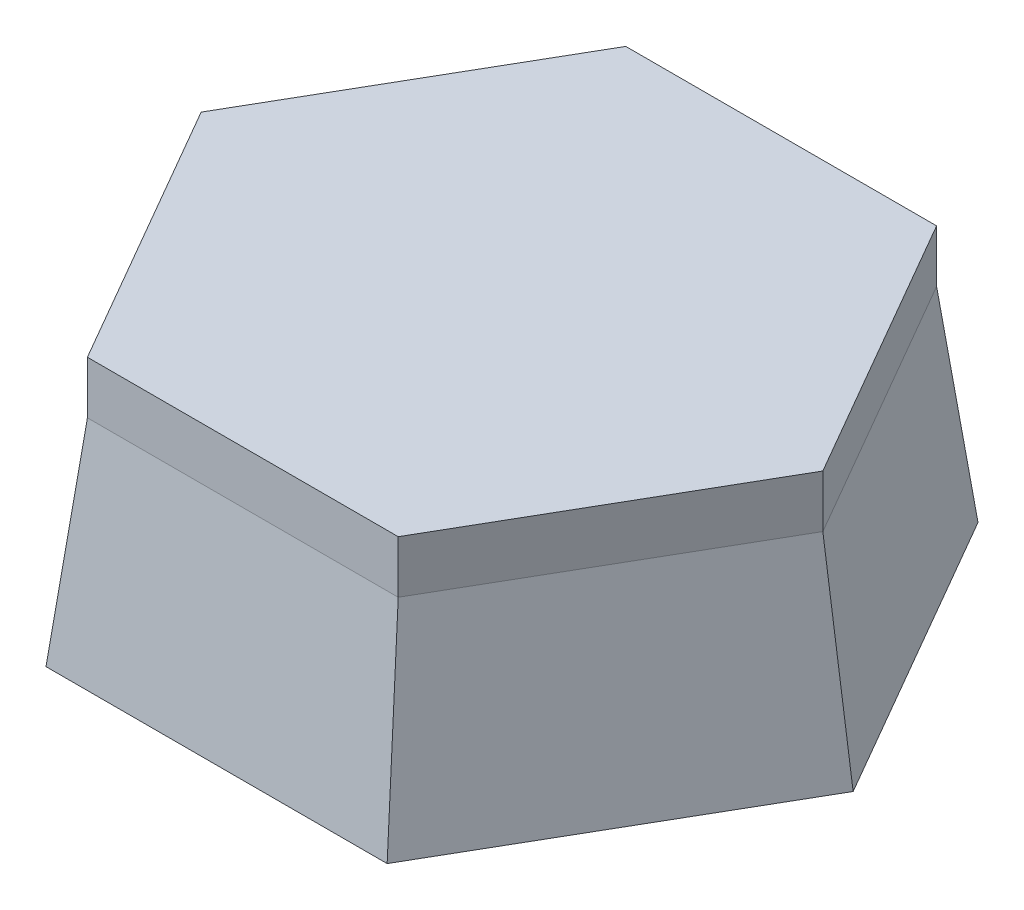
ISO-10303-21;
HEADER;
FILE_DESCRIPTION(('STEP AP214'),'2;1');
FILE_NAME('part.step','',(''),(''),'','','');
FILE_SCHEMA(('AUTOMOTIVE_DESIGN { 1 0 10303 214 1 1 1 1 }'));
ENDSEC;
DATA;
#1=APPLICATION_CONTEXT('core data for automotive mechanical design processes');
#2=APPLICATION_PROTOCOL_DEFINITION('international standard','automotive_design',2000,#1);
#3=PRODUCT_CONTEXT('',#1,'mechanical');
#4=PRODUCT('Part','Part','',(#3));
#5=PRODUCT_RELATED_PRODUCT_CATEGORY('part','',(#4));
#6=PRODUCT_DEFINITION_FORMATION('','',#4);
#7=PRODUCT_DEFINITION_CONTEXT('part definition',#1,'design');
#8=PRODUCT_DEFINITION('design','',#6,#7);
#9=PRODUCT_DEFINITION_SHAPE('','',#8);
#10=(LENGTH_UNIT() NAMED_UNIT(*) SI_UNIT(.MILLI.,.METRE.));
#11=(NAMED_UNIT(*) PLANE_ANGLE_UNIT() SI_UNIT($,.RADIAN.));
#12=(NAMED_UNIT(*) SI_UNIT($,.STERADIAN.) SOLID_ANGLE_UNIT());
#13=UNCERTAINTY_MEASURE_WITH_UNIT(LENGTH_MEASURE(1.E-05),#10,'distance_accuracy_value','');
#14=(GEOMETRIC_REPRESENTATION_CONTEXT(3) GLOBAL_UNCERTAINTY_ASSIGNED_CONTEXT((#13)) GLOBAL_UNIT_ASSIGNED_CONTEXT((#10,
#11,#12)) REPRESENTATION_CONTEXT('',''));
#15=CARTESIAN_POINT('',(0.,0.,0.));
#16=DIRECTION('',(0.,0.,1.));
#17=DIRECTION('',(1.,0.,0.));
#18=AXIS2_PLACEMENT_3D('',#15,#16,#17);
#19=CARTESIAN_POINT('',(0.,0.,0.));
#20=DIRECTION('',(0.,1.,0.));
#21=DIRECTION('',(0.,0.,1.));
#22=AXIS2_PLACEMENT_3D('',#19,#20,#21);
#23=PLANE('',#22);
#24=DIRECTION('',(0.5,0.,-0.866025403784439));
#25=VECTOR('',#24,1.);
#26=CARTESIAN_POINT('',(13.,0.,22.5166604983954));
#27=LINE('',#26,#25);
#28=CARTESIAN_POINT('',(13.,0.,22.5166604983954));
#29=VERTEX_POINT('',#28);
#30=CARTESIAN_POINT('',(26.,0.,0.));
#31=VERTEX_POINT('',#30);
#32=EDGE_CURVE('E547',#29,#31,#27,.T.);
#33=ORIENTED_EDGE('',*,*,#32,.F.);
#34=DIRECTION('',(1.,0.,0.));
#35=VECTOR('',#34,1.);
#36=CARTESIAN_POINT('',(-13.,0.,22.5166604983954));
#37=LINE('',#36,#35);
#38=CARTESIAN_POINT('',(-13.,0.,22.5166604983954));
#39=VERTEX_POINT('',#38);
#40=EDGE_CURVE('E543',#39,#29,#37,.T.);
#41=ORIENTED_EDGE('',*,*,#40,.F.);
#42=DIRECTION('',(0.5,0.,0.866025403784439));
#43=VECTOR('',#42,1.);
#44=CARTESIAN_POINT('',(-26.,0.,0.));
#45=LINE('',#44,#43);
#46=CARTESIAN_POINT('',(-26.,0.,0.));
#47=VERTEX_POINT('',#46);
#48=EDGE_CURVE('E529',#47,#39,#45,.T.);
#49=ORIENTED_EDGE('',*,*,#48,.F.);
#50=DIRECTION('',(-0.5,0.,0.866025403784439));
#51=VECTOR('',#50,1.);
#52=CARTESIAN_POINT('',(-13.,0.,-22.5166604983954));
#53=LINE('',#52,#51);
#54=CARTESIAN_POINT('',(-13.,0.,-22.5166604983954));
#55=VERTEX_POINT('',#54);
#56=EDGE_CURVE('E544',#55,#47,#53,.T.);
#57=ORIENTED_EDGE('',*,*,#56,.F.);
#58=DIRECTION('',(-1.,0.,0.));
#59=VECTOR('',#58,1.);
#60=CARTESIAN_POINT('',(13.,0.,-22.5166604983954));
#61=LINE('',#60,#59);
#62=CARTESIAN_POINT('',(13.,0.,-22.5166604983954));
#63=VERTEX_POINT('',#62);
#64=EDGE_CURVE('E443',#63,#55,#61,.T.);
#65=ORIENTED_EDGE('',*,*,#64,.F.);
#66=DIRECTION('',(-0.5,0.,-0.866025403784439));
#67=VECTOR('',#66,1.);
#68=CARTESIAN_POINT('',(26.,0.,0.));
#69=LINE('',#68,#67);
#70=EDGE_CURVE('E548',#31,#63,#69,.T.);
#71=ORIENTED_EDGE('',*,*,#70,.F.);
#72=EDGE_LOOP('',(#33,#41,#49,#57,#65,#71));
#73=FACE_BOUND('',#72,.T.);
#74=DIRECTION('',(-1.,0.,0.));
#75=VECTOR('',#74,1.);
#76=CARTESIAN_POINT('',(0.,0.,19.6963044334041));
#77=LINE('',#76,#75);
#78=CARTESIAN_POINT('',(11.3716666666667,0.,19.6963044334041));
#79=VERTEX_POINT('',#78);
#80=CARTESIAN_POINT('',(-11.3716666666667,0.,19.6963044334041));
#81=VERTEX_POINT('',#80);
#82=EDGE_CURVE('E12',#79,#81,#77,.T.);
#83=ORIENTED_EDGE('',*,*,#82,.F.);
#84=DIRECTION('',(-0.5,0.,0.866025403784438));
#85=VECTOR('',#84,1.);
#86=CARTESIAN_POINT('',(17.0575,0.,9.84815221670205));
#87=LINE('',#86,#85);
#88=CARTESIAN_POINT('',(22.7433333333333,0.,0.));
#89=VERTEX_POINT('',#88);
#90=EDGE_CURVE('E69',#89,#79,#87,.T.);
#91=ORIENTED_EDGE('',*,*,#90,.F.);
#92=DIRECTION('',(0.5,0.,0.866025403784439));
#93=VECTOR('',#92,1.);
#94=CARTESIAN_POINT('',(17.0575,0.,-9.84815221670204));
#95=LINE('',#94,#93);
#96=CARTESIAN_POINT('',(11.3716666666667,0.,-19.6963044334041));
#97=VERTEX_POINT('',#96);
#98=EDGE_CURVE('E631',#97,#89,#95,.T.);
#99=ORIENTED_EDGE('',*,*,#98,.F.);
#100=DIRECTION('',(1.,0.,0.));
#101=VECTOR('',#100,1.);
#102=CARTESIAN_POINT('',(0.,0.,-19.6963044334041));
#103=LINE('',#102,#101);
#104=CARTESIAN_POINT('',(-11.3716666666667,0.,-19.6963044334041));
#105=VERTEX_POINT('',#104);
#106=EDGE_CURVE('E632',#105,#97,#103,.T.);
#107=ORIENTED_EDGE('',*,*,#106,.F.);
#108=DIRECTION('',(0.5,0.,-0.866025403784438));
#109=VECTOR('',#108,1.);
#110=CARTESIAN_POINT('',(-17.0575,0.,-9.84815221670204));
#111=LINE('',#110,#109);
#112=CARTESIAN_POINT('',(-22.7433333333333,0.,0.));
#113=VERTEX_POINT('',#112);
#114=EDGE_CURVE('E635',#113,#105,#111,.T.);
#115=ORIENTED_EDGE('',*,*,#114,.F.);
#116=DIRECTION('',(-0.5,0.,-0.866025403784439));
#117=VECTOR('',#116,1.);
#118=CARTESIAN_POINT('',(-17.0575,0.,9.84815221670203));
#119=LINE('',#118,#117);
#120=EDGE_CURVE('E200',#81,#113,#119,.T.);
#121=ORIENTED_EDGE('',*,*,#120,.F.);
#122=EDGE_LOOP('',(#83,#91,#99,#107,#115,#121));
#123=FACE_BOUND('',#122,.T.);
#124=ADVANCED_FACE('F61',(#73,#123),#23,.F.);
#125=CARTESIAN_POINT('',(-19.1998467704537,2.77197787748424,-11.085036701321));
#126=DIRECTION('',(-0.859334419779313,0.124066406855638,-0.496136958583497));
#127=DIRECTION('',(-0.5,0.,0.866025403784439));
#128=AXIS2_PLACEMENT_3D('',#125,#126,#127);
#129=PLANE('',#128);
#130=DIRECTION('',(-0.0714467176194947,-0.989738079577421,-0.123749344950992));
#131=VECTOR('',#130,1.);
#132=CARTESIAN_POINT('',(-11.845,16.,-20.5161418156534));
#133=LINE('',#132,#131);
#134=CARTESIAN_POINT('',(-11.845,16.,-20.5161418156534));
#135=VERTEX_POINT('',#134);
#136=EDGE_CURVE('E300',#135,#55,#133,.T.);
#137=ORIENTED_EDGE('',*,*,#136,.T.);
#138=ORIENTED_EDGE('',*,*,#56,.T.);
#139=DIRECTION('',(-0.14289343523899,-0.989738079577421,0.));
#140=VECTOR('',#139,1.);
#141=CARTESIAN_POINT('',(-23.69,16.,0.));
#142=LINE('',#141,#140);
#143=CARTESIAN_POINT('',(-23.69,16.,0.));
#144=VERTEX_POINT('',#143);
#145=EDGE_CURVE('E476',#144,#47,#142,.T.);
#146=ORIENTED_EDGE('',*,*,#145,.F.);
#147=DIRECTION('',(-0.5,0.,0.866025403784439));
#148=VECTOR('',#147,1.);
#149=CARTESIAN_POINT('',(-11.845,16.,-20.5161418156534));
#150=LINE('',#149,#148);
#151=EDGE_CURVE('E319',#135,#144,#150,.T.);
#152=ORIENTED_EDGE('',*,*,#151,.F.);
#153=EDGE_LOOP('',(#137,#138,#146,#152));
#154=FACE_BOUND('',#153,.T.);
#155=ADVANCED_FACE('F412',(#154),#129,.T.);
#156=CARTESIAN_POINT('',(-19.1998467704537,2.77197787748425,11.085036701321));
#157=DIRECTION('',(-0.859334419779313,0.124066406855638,0.496136958583497));
#158=DIRECTION('',(0.5,0.,0.866025403784439));
#159=AXIS2_PLACEMENT_3D('',#156,#157,#158);
#160=PLANE('',#159);
#161=ORIENTED_EDGE('',*,*,#145,.T.);
#162=ORIENTED_EDGE('',*,*,#48,.T.);
#163=DIRECTION('',(-0.0714467176194955,-0.989738079577421,0.123749344950992));
#164=VECTOR('',#163,1.);
#165=CARTESIAN_POINT('',(-11.845,16.,20.5161418156534));
#166=LINE('',#165,#164);
#167=CARTESIAN_POINT('',(-11.845,16.,20.5161418156534));
#168=VERTEX_POINT('',#167);
#169=EDGE_CURVE('E538',#168,#39,#166,.T.);
#170=ORIENTED_EDGE('',*,*,#169,.F.);
#171=DIRECTION('',(0.5,0.,0.866025403784439));
#172=VECTOR('',#171,1.);
#173=CARTESIAN_POINT('',(-23.69,16.,0.));
#174=LINE('',#173,#172);
#175=EDGE_CURVE('E301',#144,#168,#174,.T.);
#176=ORIENTED_EDGE('',*,*,#175,.F.);
#177=EDGE_LOOP('',(#161,#162,#170,#176));
#178=FACE_BOUND('',#177,.T.);
#179=ADVANCED_FACE('F416',(#178),#160,.T.);
#180=CARTESIAN_POINT('',(0.,2.77197787748425,-22.170073402642));
#181=DIRECTION('',(0.,0.124066406855638,-0.992273917166994));
#182=DIRECTION('',(0.,0.992273917166995,0.124066406855638));
#183=AXIS2_PLACEMENT_3D('',#180,#181,#182);
#184=PLANE('',#183);
#185=DIRECTION('',(0.0714467176194947,-0.989738079577421,-0.123749344950992));
#186=VECTOR('',#185,1.);
#187=CARTESIAN_POINT('',(11.845,16.,-20.5161418156534));
#188=LINE('',#187,#186);
#189=CARTESIAN_POINT('',(11.845,16.,-20.5161418156534));
#190=VERTEX_POINT('',#189);
#191=EDGE_CURVE('E468',#190,#63,#188,.T.);
#192=ORIENTED_EDGE('',*,*,#191,.T.);
#193=ORIENTED_EDGE('',*,*,#64,.T.);
#194=ORIENTED_EDGE('',*,*,#136,.F.);
#195=DIRECTION('',(-1.,0.,0.));
#196=VECTOR('',#195,1.);
#197=CARTESIAN_POINT('',(11.845,16.,-20.5161418156534));
#198=LINE('',#197,#196);
#199=EDGE_CURVE('E362',#190,#135,#198,.T.);
#200=ORIENTED_EDGE('',*,*,#199,.F.);
#201=EDGE_LOOP('',(#192,#193,#194,#200));
#202=FACE_BOUND('',#201,.T.);
#203=ADVANCED_FACE('F450',(#202),#184,.T.);
#204=CARTESIAN_POINT('',(19.1998467704537,2.77197787748423,-11.085036701321));
#205=DIRECTION('',(0.859334419779313,0.124066406855638,-0.496136958583497));
#206=DIRECTION('',(-0.5,0.,-0.866025403784439));
#207=AXIS2_PLACEMENT_3D('',#204,#205,#206);
#208=PLANE('',#207);
#209=DIRECTION('',(0.142893435238989,-0.989738079577421,0.));
#210=VECTOR('',#209,1.);
#211=CARTESIAN_POINT('',(23.69,16.,0.));
#212=LINE('',#211,#210);
#213=CARTESIAN_POINT('',(23.69,16.,0.));
#214=VERTEX_POINT('',#213);
#215=EDGE_CURVE('E475',#214,#31,#212,.T.);
#216=ORIENTED_EDGE('',*,*,#215,.T.);
#217=ORIENTED_EDGE('',*,*,#70,.T.);
#218=ORIENTED_EDGE('',*,*,#191,.F.);
#219=DIRECTION('',(-0.5,0.,-0.866025403784438));
#220=VECTOR('',#219,1.);
#221=CARTESIAN_POINT('',(23.69,16.,0.));
#222=LINE('',#221,#220);
#223=EDGE_CURVE('E370',#214,#190,#222,.T.);
#224=ORIENTED_EDGE('',*,*,#223,.F.);
#225=EDGE_LOOP('',(#216,#217,#218,#224));
#226=FACE_BOUND('',#225,.T.);
#227=ADVANCED_FACE('F459',(#226),#208,.T.);
#228=CARTESIAN_POINT('',(19.1998467704537,2.77197787748424,11.085036701321));
#229=DIRECTION('',(0.859334419779313,0.124066406855638,0.496136958583497));
#230=DIRECTION('',(0.5,0.,-0.866025403784439));
#231=AXIS2_PLACEMENT_3D('',#228,#229,#230);
#232=PLANE('',#231);
#233=DIRECTION('',(0.0714467176194948,-0.989738079577421,0.123749344950992));
#234=VECTOR('',#233,1.);
#235=CARTESIAN_POINT('',(11.845,16.,20.5161418156534));
#236=LINE('',#235,#234);
#237=CARTESIAN_POINT('',(11.845,16.,20.5161418156534));
#238=VERTEX_POINT('',#237);
#239=EDGE_CURVE('E84',#238,#29,#236,.T.);
#240=ORIENTED_EDGE('',*,*,#239,.T.);
#241=ORIENTED_EDGE('',*,*,#32,.T.);
#242=ORIENTED_EDGE('',*,*,#215,.F.);
#243=DIRECTION('',(0.5,0.,-0.866025403784439));
#244=VECTOR('',#243,1.);
#245=CARTESIAN_POINT('',(11.845,16.,20.5161418156534));
#246=LINE('',#245,#244);
#247=EDGE_CURVE('E384',#238,#214,#246,.T.);
#248=ORIENTED_EDGE('',*,*,#247,.F.);
#249=EDGE_LOOP('',(#240,#241,#242,#248));
#250=FACE_BOUND('',#249,.T.);
#251=ADVANCED_FACE('F500',(#250),#232,.T.);
#252=CARTESIAN_POINT('',(0.,2.77197787748424,22.170073402642));
#253=DIRECTION('',(0.,0.124066406855638,0.992273917166994));
#254=DIRECTION('',(0.,-0.992273917166994,0.124066406855638));
#255=AXIS2_PLACEMENT_3D('',#252,#253,#254);
#256=PLANE('',#255);
#257=ORIENTED_EDGE('',*,*,#169,.T.);
#258=ORIENTED_EDGE('',*,*,#40,.T.);
#259=ORIENTED_EDGE('',*,*,#239,.F.);
#260=DIRECTION('',(1.,0.,0.));
#261=VECTOR('',#260,1.);
#262=CARTESIAN_POINT('',(-11.845,16.,20.5161418156534));
#263=LINE('',#262,#261);
#264=EDGE_CURVE('E292',#168,#238,#263,.T.);
#265=ORIENTED_EDGE('',*,*,#264,.F.);
#266=EDGE_LOOP('',(#257,#258,#259,#265));
#267=FACE_BOUND('',#266,.T.);
#268=ADVANCED_FACE('F411',(#267),#256,.T.);
#269=CARTESIAN_POINT('',(11.845,20.,20.5161418156534));
#270=DIRECTION('',(-0.866025403784439,0.,-0.5));
#271=DIRECTION('',(-0.5,0.,0.866025403784439));
#272=AXIS2_PLACEMENT_3D('',#269,#270,#271);
#273=PLANE('',#272);
#274=ORIENTED_EDGE('',*,*,#247,.T.);
#275=DIRECTION('',(0.,-1.,0.));
#276=VECTOR('',#275,1.);
#277=CARTESIAN_POINT('',(23.69,20.,0.));
#278=LINE('',#277,#276);
#279=CARTESIAN_POINT('',(23.69,20.,0.));
#280=VERTEX_POINT('',#279);
#281=EDGE_CURVE('E388',#280,#214,#278,.T.);
#282=ORIENTED_EDGE('',*,*,#281,.F.);
#283=DIRECTION('',(0.5,0.,-0.866025403784439));
#284=VECTOR('',#283,1.);
#285=CARTESIAN_POINT('',(11.845,20.,20.5161418156534));
#286=LINE('',#285,#284);
#287=CARTESIAN_POINT('',(11.845,20.,20.5161418156534));
#288=VERTEX_POINT('',#287);
#289=EDGE_CURVE('E808',#288,#280,#286,.T.);
#290=ORIENTED_EDGE('',*,*,#289,.F.);
#291=DIRECTION('',(0.,-1.,0.));
#292=VECTOR('',#291,1.);
#293=CARTESIAN_POINT('',(11.845,20.,20.5161418156534));
#294=LINE('',#293,#292);
#295=EDGE_CURVE('E583',#288,#238,#294,.T.);
#296=ORIENTED_EDGE('',*,*,#295,.T.);
#297=EDGE_LOOP('',(#274,#282,#290,#296));
#298=FACE_BOUND('',#297,.T.);
#299=ADVANCED_FACE('F402',(#298),#273,.F.);
#300=CARTESIAN_POINT('',(23.69,20.,0.));
#301=DIRECTION('',(-0.866025403784438,0.,0.5));
#302=DIRECTION('',(0.5,0.,0.866025403784439));
#303=AXIS2_PLACEMENT_3D('',#300,#301,#302);
#304=PLANE('',#303);
#305=ORIENTED_EDGE('',*,*,#223,.T.);
#306=DIRECTION('',(0.,-1.,0.));
#307=VECTOR('',#306,1.);
#308=CARTESIAN_POINT('',(11.845,20.,-20.5161418156534));
#309=LINE('',#308,#307);
#310=CARTESIAN_POINT('',(11.845,20.,-20.5161418156534));
#311=VERTEX_POINT('',#310);
#312=EDGE_CURVE('E371',#311,#190,#309,.T.);
#313=ORIENTED_EDGE('',*,*,#312,.F.);
#314=DIRECTION('',(-0.5,0.,-0.866025403784438));
#315=VECTOR('',#314,1.);
#316=CARTESIAN_POINT('',(23.69,20.,0.));
#317=LINE('',#316,#315);
#318=EDGE_CURVE('E579',#280,#311,#317,.T.);
#319=ORIENTED_EDGE('',*,*,#318,.F.);
#320=ORIENTED_EDGE('',*,*,#281,.T.);
#321=EDGE_LOOP('',(#305,#313,#319,#320));
#322=FACE_BOUND('',#321,.T.);
#323=ADVANCED_FACE('F351',(#322),#304,.F.);
#324=CARTESIAN_POINT('',(11.845,20.,-20.5161418156534));
#325=DIRECTION('',(0.,0.,1.));
#326=DIRECTION('',(1.,0.,0.));
#327=AXIS2_PLACEMENT_3D('',#324,#325,#326);
#328=PLANE('',#327);
#329=ORIENTED_EDGE('',*,*,#199,.T.);
#330=DIRECTION('',(0.,-1.,0.));
#331=VECTOR('',#330,1.);
#332=CARTESIAN_POINT('',(-11.845,20.,-20.5161418156534));
#333=LINE('',#332,#331);
#334=CARTESIAN_POINT('',(-11.845,20.,-20.5161418156534));
#335=VERTEX_POINT('',#334);
#336=EDGE_CURVE('E326',#335,#135,#333,.T.);
#337=ORIENTED_EDGE('',*,*,#336,.F.);
#338=DIRECTION('',(-1.,0.,0.));
#339=VECTOR('',#338,1.);
#340=CARTESIAN_POINT('',(11.845,20.,-20.5161418156534));
#341=LINE('',#340,#339);
#342=EDGE_CURVE('E575',#311,#335,#341,.T.);
#343=ORIENTED_EDGE('',*,*,#342,.F.);
#344=ORIENTED_EDGE('',*,*,#312,.T.);
#345=EDGE_LOOP('',(#329,#337,#343,#344));
#346=FACE_BOUND('',#345,.T.);
#347=ADVANCED_FACE('F347',(#346),#328,.F.);
#348=CARTESIAN_POINT('',(-11.845,20.,-20.5161418156534));
#349=DIRECTION('',(0.866025403784439,0.,0.5));
#350=DIRECTION('',(0.5,0.,-0.866025403784439));
#351=AXIS2_PLACEMENT_3D('',#348,#349,#350);
#352=PLANE('',#351);
#353=ORIENTED_EDGE('',*,*,#151,.T.);
#354=DIRECTION('',(0.,-1.,0.));
#355=VECTOR('',#354,1.);
#356=CARTESIAN_POINT('',(-23.69,20.,0.));
#357=LINE('',#356,#355);
#358=CARTESIAN_POINT('',(-23.69,20.,0.));
#359=VERTEX_POINT('',#358);
#360=EDGE_CURVE('E323',#359,#144,#357,.T.);
#361=ORIENTED_EDGE('',*,*,#360,.F.);
#362=DIRECTION('',(-0.5,0.,0.866025403784439));
#363=VECTOR('',#362,1.);
#364=CARTESIAN_POINT('',(-11.845,20.,-20.5161418156534));
#365=LINE('',#364,#363);
#366=EDGE_CURVE('E571',#335,#359,#365,.T.);
#367=ORIENTED_EDGE('',*,*,#366,.F.);
#368=ORIENTED_EDGE('',*,*,#336,.T.);
#369=EDGE_LOOP('',(#353,#361,#367,#368));
#370=FACE_BOUND('',#369,.T.);
#371=ADVANCED_FACE('F338',(#370),#352,.F.);
#372=CARTESIAN_POINT('',(-23.69,20.,0.));
#373=DIRECTION('',(0.866025403784439,0.,-0.5));
#374=DIRECTION('',(-0.5,0.,-0.866025403784439));
#375=AXIS2_PLACEMENT_3D('',#372,#373,#374);
#376=PLANE('',#375);
#377=ORIENTED_EDGE('',*,*,#175,.T.);
#378=DIRECTION('',(0.,-1.,0.));
#379=VECTOR('',#378,1.);
#380=CARTESIAN_POINT('',(-11.845,20.,20.5161418156534));
#381=LINE('',#380,#379);
#382=CARTESIAN_POINT('',(-11.845,20.,20.5161418156534));
#383=VERTEX_POINT('',#382);
#384=EDGE_CURVE('E302',#383,#168,#381,.T.);
#385=ORIENTED_EDGE('',*,*,#384,.F.);
#386=DIRECTION('',(0.5,0.,0.866025403784439));
#387=VECTOR('',#386,1.);
#388=CARTESIAN_POINT('',(-23.69,20.,0.));
#389=LINE('',#388,#387);
#390=EDGE_CURVE('E574',#359,#383,#389,.T.);
#391=ORIENTED_EDGE('',*,*,#390,.F.);
#392=ORIENTED_EDGE('',*,*,#360,.T.);
#393=EDGE_LOOP('',(#377,#385,#391,#392));
#394=FACE_BOUND('',#393,.T.);
#395=ADVANCED_FACE('F281',(#394),#376,.F.);
#396=CARTESIAN_POINT('',(-11.845,20.,20.5161418156534));
#397=DIRECTION('',(0.,0.,-1.));
#398=DIRECTION('',(-1.,0.,0.));
#399=AXIS2_PLACEMENT_3D('',#396,#397,#398);
#400=PLANE('',#399);
#401=ORIENTED_EDGE('',*,*,#264,.T.);
#402=ORIENTED_EDGE('',*,*,#295,.F.);
#403=DIRECTION('',(1.,0.,0.));
#404=VECTOR('',#403,1.);
#405=CARTESIAN_POINT('',(-11.845,20.,20.5161418156534));
#406=LINE('',#405,#404);
#407=EDGE_CURVE('E577',#383,#288,#406,.T.);
#408=ORIENTED_EDGE('',*,*,#407,.F.);
#409=ORIENTED_EDGE('',*,*,#384,.T.);
#410=EDGE_LOOP('',(#401,#402,#408,#409));
#411=FACE_BOUND('',#410,.T.);
#412=ADVANCED_FACE('F276',(#411),#400,.F.);
#413=CARTESIAN_POINT('',(0.,20.,0.));
#414=DIRECTION('',(0.,1.,0.));
#415=DIRECTION('',(0.,0.,1.));
#416=AXIS2_PLACEMENT_3D('',#413,#414,#415);
#417=PLANE('',#416);
#418=ORIENTED_EDGE('',*,*,#289,.T.);
#419=ORIENTED_EDGE('',*,*,#318,.T.);
#420=ORIENTED_EDGE('',*,*,#342,.T.);
#421=ORIENTED_EDGE('',*,*,#366,.T.);
#422=ORIENTED_EDGE('',*,*,#390,.T.);
#423=ORIENTED_EDGE('',*,*,#407,.T.);
#424=EDGE_LOOP('',(#418,#419,#420,#421,#422,#423));
#425=FACE_BOUND('',#424,.T.);
#426=ADVANCED_FACE('F272',(#425),#417,.T.);
#427=CARTESIAN_POINT('',(0.,2.16233647302384,19.4559825160342));
#428=DIRECTION('',(0.,-0.110459816142254,-0.993880590925197));
#429=DIRECTION('',(0.,0.993880590925197,-0.110459816142254));
#430=AXIS2_PLACEMENT_3D('',#427,#428,#429);
#431=PLANE('',#430);
#432=ORIENTED_EDGE('',*,*,#82,.T.);
#433=DIRECTION('',(-0.0636447104608676,-0.991865617571962,0.110235872151233));
#434=VECTOR('',#433,1.);
#435=CARTESIAN_POINT('',(-10.345,16.,17.9180656043));
#436=LINE('',#435,#434);
#437=CARTESIAN_POINT('',(-10.345,16.,17.9180656043));
#438=VERTEX_POINT('',#437);
#439=EDGE_CURVE('E205',#438,#81,#436,.T.);
#440=ORIENTED_EDGE('',*,*,#439,.F.);
#441=DIRECTION('',(-1.,0.,0.));
#442=VECTOR('',#441,1.);
#443=CARTESIAN_POINT('',(10.345,16.,17.9180656043));
#444=LINE('',#443,#442);
#445=CARTESIAN_POINT('',(10.345,16.,17.9180656043));
#446=VERTEX_POINT('',#445);
#447=EDGE_CURVE('E191',#446,#438,#444,.T.);
#448=ORIENTED_EDGE('',*,*,#447,.F.);
#449=DIRECTION('',(0.0636447104608672,-0.991865617571962,0.110235872151233));
#450=VECTOR('',#449,1.);
#451=CARTESIAN_POINT('',(10.345,16.,17.9180656043));
#452=LINE('',#451,#450);
#453=EDGE_CURVE('E201',#446,#79,#452,.T.);
#454=ORIENTED_EDGE('',*,*,#453,.T.);
#455=EDGE_LOOP('',(#432,#440,#448,#454));
#456=FACE_BOUND('',#455,.T.);
#457=ADVANCED_FACE('F275',(#456),#431,.T.);
#458=CARTESIAN_POINT('',(16.8493751144715,2.16233647302383,9.72799125801708));
#459=DIRECTION('',(-0.86072584006951,-0.110459816142254,-0.496940295462599));
#460=DIRECTION('',(-0.5,0.,0.866025403784438));
#461=AXIS2_PLACEMENT_3D('',#458,#459,#460);
#462=PLANE('',#461);
#463=ORIENTED_EDGE('',*,*,#90,.T.);
#464=ORIENTED_EDGE('',*,*,#453,.F.);
#465=DIRECTION('',(-0.5,0.,0.866025403784439));
#466=VECTOR('',#465,1.);
#467=CARTESIAN_POINT('',(20.69,16.,0.));
#468=LINE('',#467,#466);
#469=CARTESIAN_POINT('',(20.69,16.,0.));
#470=VERTEX_POINT('',#469);
#471=EDGE_CURVE('E789',#470,#446,#468,.T.);
#472=ORIENTED_EDGE('',*,*,#471,.F.);
#473=DIRECTION('',(0.127289420921735,-0.991865617571962,0.));
#474=VECTOR('',#473,1.);
#475=CARTESIAN_POINT('',(20.69,16.,0.));
#476=LINE('',#475,#474);
#477=EDGE_CURVE('E252',#470,#89,#476,.T.);
#478=ORIENTED_EDGE('',*,*,#477,.T.);
#479=EDGE_LOOP('',(#463,#464,#472,#478));
#480=FACE_BOUND('',#479,.T.);
#481=ADVANCED_FACE('F222',(#480),#462,.T.);
#482=CARTESIAN_POINT('',(-16.8493751144715,2.16233647302384,9.72799125801707));
#483=DIRECTION('',(0.860725840069511,-0.110459816142254,-0.496940295462598));
#484=DIRECTION('',(-0.5,0.,-0.866025403784439));
#485=AXIS2_PLACEMENT_3D('',#482,#483,#484);
#486=PLANE('',#485);
#487=ORIENTED_EDGE('',*,*,#120,.T.);
#488=DIRECTION('',(-0.127289420921735,-0.991865617571962,0.));
#489=VECTOR('',#488,1.);
#490=CARTESIAN_POINT('',(-20.69,16.,0.));
#491=LINE('',#490,#489);
#492=CARTESIAN_POINT('',(-20.69,16.,0.));
#493=VERTEX_POINT('',#492);
#494=EDGE_CURVE('E174',#493,#113,#491,.T.);
#495=ORIENTED_EDGE('',*,*,#494,.F.);
#496=DIRECTION('',(-0.5,0.,-0.866025403784439));
#497=VECTOR('',#496,1.);
#498=CARTESIAN_POINT('',(-10.345,16.,17.9180656043));
#499=LINE('',#498,#497);
#500=EDGE_CURVE('E182',#438,#493,#499,.T.);
#501=ORIENTED_EDGE('',*,*,#500,.F.);
#502=ORIENTED_EDGE('',*,*,#439,.T.);
#503=EDGE_LOOP('',(#487,#495,#501,#502));
#504=FACE_BOUND('',#503,.T.);
#505=ADVANCED_FACE('F198',(#504),#486,.T.);
#506=CARTESIAN_POINT('',(-16.8493751144715,2.16233647302383,-9.72799125801708));
#507=DIRECTION('',(0.86072584006951,-0.110459816142254,0.496940295462599));
#508=DIRECTION('',(0.5,0.,-0.866025403784438));
#509=AXIS2_PLACEMENT_3D('',#506,#507,#508);
#510=PLANE('',#509);
#511=ORIENTED_EDGE('',*,*,#114,.T.);
#512=DIRECTION('',(-0.0636447104608674,-0.991865617571962,-0.110235872151233));
#513=VECTOR('',#512,1.);
#514=CARTESIAN_POINT('',(-10.345,16.,-17.9180656043));
#515=LINE('',#514,#513);
#516=CARTESIAN_POINT('',(-10.345,16.,-17.9180656043));
#517=VERTEX_POINT('',#516);
#518=EDGE_CURVE('E177',#517,#105,#515,.T.);
#519=ORIENTED_EDGE('',*,*,#518,.F.);
#520=DIRECTION('',(0.5,0.,-0.866025403784439));
#521=VECTOR('',#520,1.);
#522=CARTESIAN_POINT('',(-20.69,16.,0.));
#523=LINE('',#522,#521);
#524=EDGE_CURVE('E169',#493,#517,#523,.T.);
#525=ORIENTED_EDGE('',*,*,#524,.F.);
#526=ORIENTED_EDGE('',*,*,#494,.T.);
#527=EDGE_LOOP('',(#511,#519,#525,#526));
#528=FACE_BOUND('',#527,.T.);
#529=ADVANCED_FACE('F172',(#528),#510,.T.);
#530=CARTESIAN_POINT('',(0.,2.16233647302384,-19.4559825160342));
#531=DIRECTION('',(0.,-0.110459816142254,0.993880590925197));
#532=DIRECTION('',(0.,-0.993880590925197,-0.110459816142254));
#533=AXIS2_PLACEMENT_3D('',#530,#531,#532);
#534=PLANE('',#533);
#535=ORIENTED_EDGE('',*,*,#106,.T.);
#536=DIRECTION('',(0.0636447104608677,-0.991865617571962,-0.110235872151233));
#537=VECTOR('',#536,1.);
#538=CARTESIAN_POINT('',(10.345,16.,-17.9180656043));
#539=LINE('',#538,#537);
#540=CARTESIAN_POINT('',(10.345,16.,-17.9180656043));
#541=VERTEX_POINT('',#540);
#542=EDGE_CURVE('E76',#541,#97,#539,.T.);
#543=ORIENTED_EDGE('',*,*,#542,.F.);
#544=DIRECTION('',(1.,0.,0.));
#545=VECTOR('',#544,1.);
#546=CARTESIAN_POINT('',(-10.345,16.,-17.9180656043));
#547=LINE('',#546,#545);
#548=EDGE_CURVE('E181',#517,#541,#547,.T.);
#549=ORIENTED_EDGE('',*,*,#548,.F.);
#550=ORIENTED_EDGE('',*,*,#518,.T.);
#551=EDGE_LOOP('',(#535,#543,#549,#550));
#552=FACE_BOUND('',#551,.T.);
#553=ADVANCED_FACE('F228',(#552),#534,.T.);
#554=CARTESIAN_POINT('',(16.8493751144715,2.16233647302384,-9.72799125801708));
#555=DIRECTION('',(-0.860725840069511,-0.110459816142254,0.496940295462599));
#556=DIRECTION('',(0.5,0.,0.866025403784439));
#557=AXIS2_PLACEMENT_3D('',#554,#555,#556);
#558=PLANE('',#557);
#559=ORIENTED_EDGE('',*,*,#98,.T.);
#560=ORIENTED_EDGE('',*,*,#477,.F.);
#561=DIRECTION('',(0.5,0.,0.866025403784439));
#562=VECTOR('',#561,1.);
#563=CARTESIAN_POINT('',(10.345,16.,-17.9180656043));
#564=LINE('',#563,#562);
#565=EDGE_CURVE('E258',#541,#470,#564,.T.);
#566=ORIENTED_EDGE('',*,*,#565,.F.);
#567=ORIENTED_EDGE('',*,*,#542,.T.);
#568=EDGE_LOOP('',(#559,#560,#566,#567));
#569=FACE_BOUND('',#568,.T.);
#570=ADVANCED_FACE('F263',(#569),#558,.T.);
#571=CARTESIAN_POINT('',(0.,16.,0.));
#572=DIRECTION('',(0.,-1.,0.));
#573=DIRECTION('',(0.,0.,-1.));
#574=AXIS2_PLACEMENT_3D('',#571,#572,#573);
#575=PLANE('',#574);
#576=ORIENTED_EDGE('',*,*,#500,.T.);
#577=ORIENTED_EDGE('',*,*,#524,.T.);
#578=ORIENTED_EDGE('',*,*,#548,.T.);
#579=ORIENTED_EDGE('',*,*,#565,.T.);
#580=ORIENTED_EDGE('',*,*,#471,.T.);
#581=ORIENTED_EDGE('',*,*,#447,.T.);
#582=EDGE_LOOP('',(#576,#577,#578,#579,#580,#581));
#583=FACE_BOUND('',#582,.T.);
#584=ADVANCED_FACE('F189',(#583),#575,.T.);
#585=CLOSED_SHELL('',(#124,#155,#179,#203,#227,#251,#268,#299,#323,#347,#371,#395,#412,#426,
#457,#481,#505,#529,#553,#570,#584));
#586=MANIFOLD_SOLID_BREP('B2',#585);
#587=ADVANCED_BREP_SHAPE_REPRESENTATION('',(#18,#586),#14);
#588=SHAPE_DEFINITION_REPRESENTATION(#9,#587);
ENDSEC;
END-ISO-10303-21;
